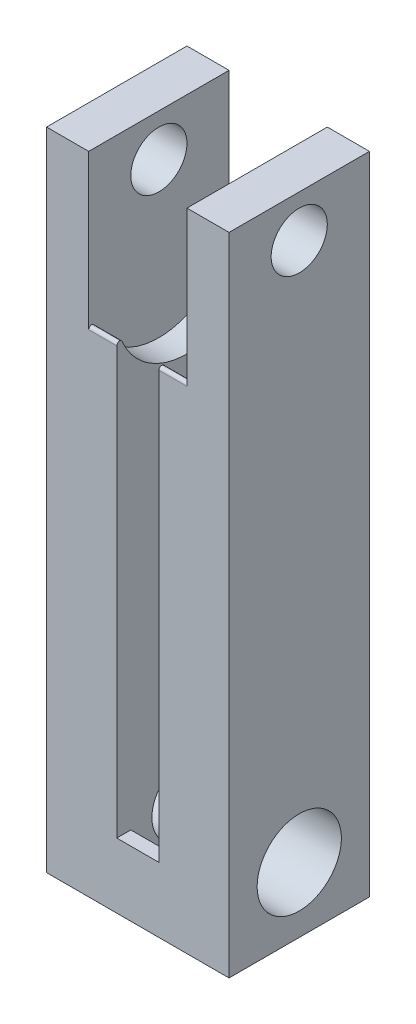
ISO-10303-21;
HEADER;
FILE_DESCRIPTION(('STEP AP214'),'2;1');
FILE_NAME('part.step','',(''),(''),'','','');
FILE_SCHEMA(('AUTOMOTIVE_DESIGN { 1 0 10303 214 1 1 1 1 }'));
ENDSEC;
DATA;
#1=APPLICATION_CONTEXT('core data for automotive mechanical design processes');
#2=APPLICATION_PROTOCOL_DEFINITION('international standard','automotive_design',2000,#1);
#3=PRODUCT_CONTEXT('',#1,'mechanical');
#4=PRODUCT('Part','Part','',(#3));
#5=PRODUCT_RELATED_PRODUCT_CATEGORY('part','',(#4));
#6=PRODUCT_DEFINITION_FORMATION('','',#4);
#7=PRODUCT_DEFINITION_CONTEXT('part definition',#1,'design');
#8=PRODUCT_DEFINITION('design','',#6,#7);
#9=PRODUCT_DEFINITION_SHAPE('','',#8);
#10=(LENGTH_UNIT() NAMED_UNIT(*) SI_UNIT(.MILLI.,.METRE.));
#11=(NAMED_UNIT(*) PLANE_ANGLE_UNIT() SI_UNIT($,.RADIAN.));
#12=(NAMED_UNIT(*) SI_UNIT($,.STERADIAN.) SOLID_ANGLE_UNIT());
#13=UNCERTAINTY_MEASURE_WITH_UNIT(LENGTH_MEASURE(1.E-05),#10,'distance_accuracy_value','');
#14=(GEOMETRIC_REPRESENTATION_CONTEXT(3) GLOBAL_UNCERTAINTY_ASSIGNED_CONTEXT((#13)) GLOBAL_UNIT_ASSIGNED_CONTEXT((#10,
#11,#12)) REPRESENTATION_CONTEXT('',''));
#15=CARTESIAN_POINT('',(0.,0.,0.));
#16=DIRECTION('',(0.,0.,1.));
#17=DIRECTION('',(1.,0.,0.));
#18=AXIS2_PLACEMENT_3D('',#15,#16,#17);
#19=CARTESIAN_POINT('',(-65.,65.,-25.));
#20=DIRECTION('',(1.,0.,0.));
#21=DIRECTION('',(0.,0.,-1.));
#22=AXIS2_PLACEMENT_3D('',#19,#20,#21);
#23=CYLINDRICAL_SURFACE('',#22,10.);
#24=CARTESIAN_POINT('',(-65.,65.,-25.));
#25=DIRECTION('',(1.,0.,0.));
#26=DIRECTION('',(0.,0.,-1.));
#27=AXIS2_PLACEMENT_3D('',#24,#25,#26);
#28=CIRCLE('',#27,10.);
#29=CARTESIAN_POINT('',(-65.,65.,-35.));
#30=VERTEX_POINT('',#29);
#31=EDGE_CURVE('E309',#30,#30,#28,.T.);
#32=ORIENTED_EDGE('',*,*,#31,.F.);
#33=EDGE_LOOP('',(#32));
#34=FACE_BOUND('',#33,.T.);
#35=CARTESIAN_POINT('',(-50.,65.,-25.));
#36=DIRECTION('',(-1.,0.,0.));
#37=DIRECTION('',(0.,0.,1.));
#38=AXIS2_PLACEMENT_3D('',#35,#36,#37);
#39=CIRCLE('',#38,10.);
#40=CARTESIAN_POINT('',(-50.,65.,-15.));
#41=VERTEX_POINT('',#40);
#42=EDGE_CURVE('E312',#41,#41,#39,.T.);
#43=ORIENTED_EDGE('',*,*,#42,.F.);
#44=EDGE_LOOP('',(#43));
#45=FACE_BOUND('',#44,.T.);
#46=ADVANCED_FACE('F53',(#34,#45),#23,.F.);
#47=CARTESIAN_POINT('',(-65.,10.,0.));
#48=DIRECTION('',(1.,0.,0.));
#49=DIRECTION('',(0.,0.,-1.));
#50=AXIS2_PLACEMENT_3D('',#47,#48,#49);
#51=PLANE('',#50);
#52=CARTESIAN_POINT('',(-65.,-126.82547914244,-25.));
#53=DIRECTION('',(1.,0.,0.));
#54=DIRECTION('',(0.,0.,-1.));
#55=AXIS2_PLACEMENT_3D('',#52,#53,#54);
#56=CIRCLE('',#55,12.5);
#57=CARTESIAN_POINT('',(-65.,-126.82547914244,-37.5));
#58=VERTEX_POINT('',#57);
#59=EDGE_CURVE('E297',#58,#58,#56,.T.);
#60=ORIENTED_EDGE('',*,*,#59,.T.);
#61=EDGE_LOOP('',(#60));
#62=FACE_BOUND('',#61,.T.);
#63=ORIENTED_EDGE('',*,*,#31,.T.);
#64=EDGE_LOOP('',(#63));
#65=FACE_BOUND('',#64,.T.);
#66=DIRECTION('',(0.,-1.,0.));
#67=VECTOR('',#66,1.);
#68=CARTESIAN_POINT('',(-65.,10.,-50.));
#69=LINE('',#68,#67);
#70=CARTESIAN_POINT('',(-65.,80.,-50.));
#71=VERTEX_POINT('',#70);
#72=CARTESIAN_POINT('',(-65.,-150.,-50.));
#73=VERTEX_POINT('',#72);
#74=EDGE_CURVE('E330',#71,#73,#69,.T.);
#75=ORIENTED_EDGE('',*,*,#74,.T.);
#76=DIRECTION('',(0.,0.,-1.));
#77=VECTOR('',#76,1.);
#78=CARTESIAN_POINT('',(-65.,-150.,0.));
#79=LINE('',#78,#77);
#80=CARTESIAN_POINT('',(-65.,-150.,0.));
#81=VERTEX_POINT('',#80);
#82=EDGE_CURVE('E300',#81,#73,#79,.T.);
#83=ORIENTED_EDGE('',*,*,#82,.F.);
#84=DIRECTION('',(0.,-1.,0.));
#85=VECTOR('',#84,1.);
#86=CARTESIAN_POINT('',(-65.,10.,0.));
#87=LINE('',#86,#85);
#88=CARTESIAN_POINT('',(-65.,80.,0.));
#89=VERTEX_POINT('',#88);
#90=EDGE_CURVE('E186',#89,#81,#87,.T.);
#91=ORIENTED_EDGE('',*,*,#90,.F.);
#92=DIRECTION('',(0.,0.,1.));
#93=VECTOR('',#92,1.);
#94=CARTESIAN_POINT('',(-65.,80.,-50.));
#95=LINE('',#94,#93);
#96=EDGE_CURVE('E315',#71,#89,#95,.T.);
#97=ORIENTED_EDGE('',*,*,#96,.F.);
#98=EDGE_LOOP('',(#75,#83,#91,#97));
#99=FACE_BOUND('',#98,.T.);
#100=ADVANCED_FACE('F389',(#62,#65,#99),#51,.F.);
#101=CARTESIAN_POINT('',(0.,80.,0.));
#102=DIRECTION('',(0.,1.,0.));
#103=DIRECTION('',(0.,0.,1.));
#104=AXIS2_PLACEMENT_3D('',#101,#102,#103);
#105=PLANE('',#104);
#106=ORIENTED_EDGE('',*,*,#96,.T.);
#107=DIRECTION('',(1.,0.,0.));
#108=VECTOR('',#107,1.);
#109=CARTESIAN_POINT('',(-65.,80.,0.));
#110=LINE('',#109,#108);
#111=CARTESIAN_POINT('',(-50.,80.,0.));
#112=VERTEX_POINT('',#111);
#113=EDGE_CURVE('E318',#89,#112,#110,.T.);
#114=ORIENTED_EDGE('',*,*,#113,.T.);
#115=DIRECTION('',(0.,0.,-1.));
#116=VECTOR('',#115,1.);
#117=CARTESIAN_POINT('',(-50.,80.,-50.));
#118=LINE('',#117,#116);
#119=CARTESIAN_POINT('',(-50.,80.,-50.));
#120=VERTEX_POINT('',#119);
#121=EDGE_CURVE('E320',#112,#120,#118,.T.);
#122=ORIENTED_EDGE('',*,*,#121,.T.);
#123=DIRECTION('',(-1.,0.,0.));
#124=VECTOR('',#123,1.);
#125=CARTESIAN_POINT('',(-65.,80.,-50.));
#126=LINE('',#125,#124);
#127=EDGE_CURVE('E322',#120,#71,#126,.T.);
#128=ORIENTED_EDGE('',*,*,#127,.T.);
#129=EDGE_LOOP('',(#106,#114,#122,#128));
#130=FACE_BOUND('',#129,.T.);
#131=ADVANCED_FACE('F392',(#130),#105,.T.);
#132=CARTESIAN_POINT('',(-50.,80.,-50.));
#133=DIRECTION('',(-1.,0.,0.));
#134=DIRECTION('',(0.,0.,1.));
#135=AXIS2_PLACEMENT_3D('',#132,#133,#134);
#136=PLANE('',#135);
#137=ORIENTED_EDGE('',*,*,#42,.T.);
#138=EDGE_LOOP('',(#137));
#139=FACE_BOUND('',#138,.T.);
#140=DIRECTION('',(0.,-1.,0.));
#141=VECTOR('',#140,1.);
#142=CARTESIAN_POINT('',(-50.,80.,0.));
#143=LINE('',#142,#141);
#144=CARTESIAN_POINT('',(-50.,25.,0.));
#145=VERTEX_POINT('',#144);
#146=EDGE_CURVE('E326',#112,#145,#143,.T.);
#147=ORIENTED_EDGE('',*,*,#146,.T.);
#148=CARTESIAN_POINT('',(-50.,25.,-0.999999999999994));
#149=DIRECTION('',(-1.,0.,0.));
#150=DIRECTION('',(0.,0.,1.));
#151=AXIS2_PLACEMENT_3D('',#148,#149,#150);
#152=CIRCLE('',#151,1.);
#153=CARTESIAN_POINT('',(-50.,25.3846153846154,-1.92307692307692));
#154=VERTEX_POINT('',#153);
#155=EDGE_CURVE('E341',#145,#154,#152,.T.);
#156=ORIENTED_EDGE('',*,*,#155,.T.);
#157=CARTESIAN_POINT('',(-50.,35.,-25.));
#158=DIRECTION('',(1.,0.,0.));
#159=DIRECTION('',(0.,0.,-1.));
#160=AXIS2_PLACEMENT_3D('',#157,#158,#159);
#161=CIRCLE('',#160,25.);
#162=CARTESIAN_POINT('',(-50.,25.3846153846154,-48.0769230769231));
#163=VERTEX_POINT('',#162);
#164=EDGE_CURVE('E306',#163,#154,#161,.F.);
#165=ORIENTED_EDGE('',*,*,#164,.F.);
#166=CARTESIAN_POINT('',(-50.,25.,-49.));
#167=DIRECTION('',(-1.,0.,0.));
#168=DIRECTION('',(0.,0.,1.));
#169=AXIS2_PLACEMENT_3D('',#166,#167,#168);
#170=CIRCLE('',#169,1.);
#171=CARTESIAN_POINT('',(-50.,25.,-50.));
#172=VERTEX_POINT('',#171);
#173=EDGE_CURVE('E61',#163,#172,#170,.T.);
#174=ORIENTED_EDGE('',*,*,#173,.T.);
#175=DIRECTION('',(0.,-1.,0.));
#176=VECTOR('',#175,1.);
#177=CARTESIAN_POINT('',(-50.,80.,-50.));
#178=LINE('',#177,#176);
#179=EDGE_CURVE('E76',#120,#172,#178,.T.);
#180=ORIENTED_EDGE('',*,*,#179,.F.);
#181=ORIENTED_EDGE('',*,*,#121,.F.);
#182=EDGE_LOOP('',(#147,#156,#165,#174,#180,#181));
#183=FACE_BOUND('',#182,.T.);
#184=ADVANCED_FACE('F346',(#139,#183),#136,.F.);
#185=CARTESIAN_POINT('',(0.,-150.,0.));
#186=DIRECTION('',(0.,-1.,0.));
#187=DIRECTION('',(0.,0.,-1.));
#188=AXIS2_PLACEMENT_3D('',#185,#186,#187);
#189=PLANE('',#188);
#190=ORIENTED_EDGE('',*,*,#82,.T.);
#191=DIRECTION('',(1.,0.,0.));
#192=VECTOR('',#191,1.);
#193=CARTESIAN_POINT('',(-65.,-150.,-50.));
#194=LINE('',#193,#192);
#195=CARTESIAN_POINT('',(0.,-150.,-50.));
#196=VERTEX_POINT('',#195);
#197=EDGE_CURVE('E192',#73,#196,#194,.T.);
#198=ORIENTED_EDGE('',*,*,#197,.T.);
#199=DIRECTION('',(0.,0.,1.));
#200=VECTOR('',#199,1.);
#201=CARTESIAN_POINT('',(0.,-150.,-50.));
#202=LINE('',#201,#200);
#203=CARTESIAN_POINT('',(0.,-150.,0.));
#204=VERTEX_POINT('',#203);
#205=EDGE_CURVE('E198',#196,#204,#202,.T.);
#206=ORIENTED_EDGE('',*,*,#205,.T.);
#207=DIRECTION('',(-1.,0.,0.));
#208=VECTOR('',#207,1.);
#209=CARTESIAN_POINT('',(-65.,-150.,0.));
#210=LINE('',#209,#208);
#211=EDGE_CURVE('E179',#204,#81,#210,.T.);
#212=ORIENTED_EDGE('',*,*,#211,.T.);
#213=EDGE_LOOP('',(#190,#198,#206,#212));
#214=FACE_BOUND('',#213,.T.);
#215=ADVANCED_FACE('F203',(#214),#189,.T.);
#216=CARTESIAN_POINT('',(-190.,-126.82547914244,-25.));
#217=DIRECTION('',(1.,0.,0.));
#218=DIRECTION('',(0.,0.,-1.));
#219=AXIS2_PLACEMENT_3D('',#216,#217,#218);
#220=CYLINDRICAL_SURFACE('',#219,12.5);
#221=CARTESIAN_POINT('',(-40.,-126.82547914244,-25.));
#222=DIRECTION('',(1.,0.,0.));
#223=DIRECTION('',(0.,0.,-1.));
#224=AXIS2_PLACEMENT_3D('',#221,#222,#223);
#225=CIRCLE('',#224,12.5);
#226=CARTESIAN_POINT('',(-40.,-126.82547914244,-37.5));
#227=VERTEX_POINT('',#226);
#228=EDGE_CURVE('E294',#227,#227,#225,.T.);
#229=ORIENTED_EDGE('',*,*,#228,.T.);
#230=EDGE_LOOP('',(#229));
#231=FACE_BOUND('',#230,.T.);
#232=ORIENTED_EDGE('',*,*,#59,.F.);
#233=EDGE_LOOP('',(#232));
#234=FACE_BOUND('',#233,.T.);
#235=ADVANCED_FACE('F441',(#231,#234),#220,.F.);
#236=CARTESIAN_POINT('',(0.00200000000000638,25.,-49.));
#237=DIRECTION('',(-1.,0.,0.));
#238=DIRECTION('',(0.,0.,1.));
#239=AXIS2_PLACEMENT_3D('',#236,#237,#238);
#240=CYLINDRICAL_SURFACE('',#239,1.);
#241=CARTESIAN_POINT('',(-40.,25.,-49.));
#242=DIRECTION('',(-1.,0.,0.));
#243=DIRECTION('',(0.,0.,1.));
#244=AXIS2_PLACEMENT_3D('',#241,#242,#243);
#245=CIRCLE('',#244,1.);
#246=CARTESIAN_POINT('',(-40.,25.,-50.));
#247=VERTEX_POINT('',#246);
#248=CARTESIAN_POINT('',(-40.,25.3846153846154,-48.0769230769231));
#249=VERTEX_POINT('',#248);
#250=EDGE_CURVE('E12',#247,#249,#245,.F.);
#251=ORIENTED_EDGE('',*,*,#250,.F.);
#252=DIRECTION('',(-1.,0.,0.));
#253=VECTOR('',#252,1.);
#254=CARTESIAN_POINT('',(0.,25.,-50.));
#255=LINE('',#254,#253);
#256=EDGE_CURVE('E339',#172,#247,#255,.F.);
#257=ORIENTED_EDGE('',*,*,#256,.F.);
#258=ORIENTED_EDGE('',*,*,#173,.F.);
#259=DIRECTION('',(-1.,0.,0.));
#260=VECTOR('',#259,1.);
#261=CARTESIAN_POINT('',(0.00200000000000574,25.3846153846154,-48.0769230769231));
#262=LINE('',#261,#260);
#263=EDGE_CURVE('E334',#249,#163,#262,.T.);
#264=ORIENTED_EDGE('',*,*,#263,.F.);
#265=EDGE_LOOP('',(#251,#257,#258,#264));
#266=FACE_BOUND('',#265,.T.);
#267=ADVANCED_FACE('F55',(#266),#240,.T.);
#268=CARTESIAN_POINT('',(0.00200000000001188,25.,-1.));
#269=DIRECTION('',(-1.,0.,0.));
#270=DIRECTION('',(0.,0.,1.));
#271=AXIS2_PLACEMENT_3D('',#268,#269,#270);
#272=CYLINDRICAL_SURFACE('',#271,1.);
#273=CARTESIAN_POINT('',(-40.,25.,-0.999999999999995));
#274=DIRECTION('',(-1.,0.,0.));
#275=DIRECTION('',(0.,0.,1.));
#276=AXIS2_PLACEMENT_3D('',#273,#274,#275);
#277=CIRCLE('',#276,1.);
#278=CARTESIAN_POINT('',(-40.,25.3846153846154,-1.92307692307692));
#279=VERTEX_POINT('',#278);
#280=CARTESIAN_POINT('',(-40.,25.,0.));
#281=VERTEX_POINT('',#280);
#282=EDGE_CURVE('E291',#279,#281,#277,.F.);
#283=ORIENTED_EDGE('',*,*,#282,.F.);
#284=DIRECTION('',(-1.,0.,0.));
#285=VECTOR('',#284,1.);
#286=CARTESIAN_POINT('',(0.00200000000001214,25.3846153846154,-1.92307692307692));
#287=LINE('',#286,#285);
#288=EDGE_CURVE('E336',#154,#279,#287,.F.);
#289=ORIENTED_EDGE('',*,*,#288,.F.);
#290=ORIENTED_EDGE('',*,*,#155,.F.);
#291=DIRECTION('',(-1.,0.,0.));
#292=VECTOR('',#291,1.);
#293=CARTESIAN_POINT('',(0.,25.,0.));
#294=LINE('',#293,#292);
#295=EDGE_CURVE('E332',#281,#145,#294,.T.);
#296=ORIENTED_EDGE('',*,*,#295,.F.);
#297=EDGE_LOOP('',(#283,#289,#290,#296));
#298=FACE_BOUND('',#297,.T.);
#299=ADVANCED_FACE('F399',(#298),#272,.T.);
#300=CARTESIAN_POINT('',(0.00200000000000894,35.,-25.));
#301=DIRECTION('',(-1.,0.,0.));
#302=DIRECTION('',(0.,0.,1.));
#303=AXIS2_PLACEMENT_3D('',#300,#301,#302);
#304=CYLINDRICAL_SURFACE('',#303,25.);
#305=ORIENTED_EDGE('',*,*,#288,.T.);
#306=CARTESIAN_POINT('',(-40.,35.,-25.));
#307=DIRECTION('',(-1.,0.,0.));
#308=DIRECTION('',(0.,0.,1.));
#309=AXIS2_PLACEMENT_3D('',#306,#307,#308);
#310=CIRCLE('',#309,25.);
#311=EDGE_CURVE('E276',#279,#249,#310,.F.);
#312=ORIENTED_EDGE('',*,*,#311,.T.);
#313=ORIENTED_EDGE('',*,*,#263,.T.);
#314=ORIENTED_EDGE('',*,*,#164,.T.);
#315=EDGE_LOOP('',(#305,#312,#313,#314));
#316=FACE_BOUND('',#315,.T.);
#317=ADVANCED_FACE('F401',(#316),#304,.F.);
#318=CARTESIAN_POINT('',(-40.,-150.,0.));
#319=DIRECTION('',(-1.,0.,0.));
#320=DIRECTION('',(0.,0.,1.));
#321=AXIS2_PLACEMENT_3D('',#318,#319,#320);
#322=PLANE('',#321);
#323=ORIENTED_EDGE('',*,*,#228,.F.);
#324=EDGE_LOOP('',(#323));
#325=FACE_BOUND('',#324,.T.);
#326=DIRECTION('',(0.,1.,0.));
#327=VECTOR('',#326,1.);
#328=CARTESIAN_POINT('',(-40.,-150.,0.));
#329=LINE('',#328,#327);
#330=CARTESIAN_POINT('',(-40.,-126.82547914244,0.));
#331=VERTEX_POINT('',#330);
#332=EDGE_CURVE('E191',#331,#281,#329,.T.);
#333=ORIENTED_EDGE('',*,*,#332,.F.);
#334=DIRECTION('',(0.,0.,-1.));
#335=VECTOR('',#334,1.);
#336=CARTESIAN_POINT('',(-40.,-126.82547914244,-4.99999999999999));
#337=LINE('',#336,#335);
#338=CARTESIAN_POINT('',(-40.,-126.82547914244,-5.));
#339=VERTEX_POINT('',#338);
#340=EDGE_CURVE('E266',#331,#339,#337,.T.);
#341=ORIENTED_EDGE('',*,*,#340,.T.);
#342=CARTESIAN_POINT('',(-40.,-126.82547914244,-25.));
#343=DIRECTION('',(-1.,0.,0.));
#344=DIRECTION('',(0.,0.,1.));
#345=AXIS2_PLACEMENT_3D('',#342,#343,#344);
#346=CIRCLE('',#345,20.);
#347=CARTESIAN_POINT('',(-40.,-126.82547914244,-45.));
#348=VERTEX_POINT('',#347);
#349=EDGE_CURVE('E277',#339,#348,#346,.F.);
#350=ORIENTED_EDGE('',*,*,#349,.T.);
#351=DIRECTION('',(0.,0.,-1.));
#352=VECTOR('',#351,1.);
#353=CARTESIAN_POINT('',(-40.,-126.82547914244,-45.));
#354=LINE('',#353,#352);
#355=CARTESIAN_POINT('',(-40.,-126.82547914244,-50.));
#356=VERTEX_POINT('',#355);
#357=EDGE_CURVE('E274',#348,#356,#354,.T.);
#358=ORIENTED_EDGE('',*,*,#357,.T.);
#359=DIRECTION('',(0.,1.,0.));
#360=VECTOR('',#359,1.);
#361=CARTESIAN_POINT('',(-40.,-150.,-50.));
#362=LINE('',#361,#360);
#363=EDGE_CURVE('E304',#356,#247,#362,.T.);
#364=ORIENTED_EDGE('',*,*,#363,.T.);
#365=ORIENTED_EDGE('',*,*,#250,.T.);
#366=ORIENTED_EDGE('',*,*,#311,.F.);
#367=ORIENTED_EDGE('',*,*,#282,.T.);
#368=EDGE_LOOP('',(#333,#341,#350,#358,#364,#365,#366,#367));
#369=FACE_BOUND('',#368,.T.);
#370=ADVANCED_FACE('F356',(#325,#369),#322,.F.);
#371=CARTESIAN_POINT('',(0.,10.,0.));
#372=DIRECTION('',(0.,0.,-1.));
#373=DIRECTION('',(-1.,0.,0.));
#374=AXIS2_PLACEMENT_3D('',#371,#372,#373);
#375=PLANE('',#374);
#376=ORIENTED_EDGE('',*,*,#211,.F.);
#377=DIRECTION('',(0.,-1.,0.));
#378=VECTOR('',#377,1.);
#379=CARTESIAN_POINT('',(0.,10.,0.));
#380=LINE('',#379,#378);
#381=CARTESIAN_POINT('',(0.,80.,0.));
#382=VERTEX_POINT('',#381);
#383=EDGE_CURVE('E183',#382,#204,#380,.T.);
#384=ORIENTED_EDGE('',*,*,#383,.F.);
#385=DIRECTION('',(1.,0.,0.));
#386=VECTOR('',#385,1.);
#387=CARTESIAN_POINT('',(0.,80.,0.));
#388=LINE('',#387,#386);
#389=CARTESIAN_POINT('',(-15.,80.,0.));
#390=VERTEX_POINT('',#389);
#391=EDGE_CURVE('E238',#390,#382,#388,.T.);
#392=ORIENTED_EDGE('',*,*,#391,.F.);
#393=DIRECTION('',(0.,-1.,0.));
#394=VECTOR('',#393,1.);
#395=CARTESIAN_POINT('',(-15.,80.,0.));
#396=LINE('',#395,#394);
#397=CARTESIAN_POINT('',(-15.,25.,0.));
#398=VERTEX_POINT('',#397);
#399=EDGE_CURVE('E234',#390,#398,#396,.T.);
#400=ORIENTED_EDGE('',*,*,#399,.T.);
#401=DIRECTION('',(-1.,0.,0.));
#402=VECTOR('',#401,1.);
#403=CARTESIAN_POINT('',(0.,25.,0.));
#404=LINE('',#403,#402);
#405=CARTESIAN_POINT('',(-25.,25.,0.));
#406=VERTEX_POINT('',#405);
#407=EDGE_CURVE('E230',#398,#406,#404,.T.);
#408=ORIENTED_EDGE('',*,*,#407,.T.);
#409=DIRECTION('',(0.,-1.,0.));
#410=VECTOR('',#409,1.);
#411=CARTESIAN_POINT('',(-25.,150.,0.));
#412=LINE('',#411,#410);
#413=CARTESIAN_POINT('',(-25.,-126.82547914244,0.));
#414=VERTEX_POINT('',#413);
#415=EDGE_CURVE('E237',#406,#414,#412,.T.);
#416=ORIENTED_EDGE('',*,*,#415,.T.);
#417=DIRECTION('',(1.,0.,0.));
#418=VECTOR('',#417,1.);
#419=CARTESIAN_POINT('',(-95.1095129444772,-126.82547914244,0.));
#420=LINE('',#419,#418);
#421=EDGE_CURVE('E267',#331,#414,#420,.T.);
#422=ORIENTED_EDGE('',*,*,#421,.F.);
#423=ORIENTED_EDGE('',*,*,#332,.T.);
#424=ORIENTED_EDGE('',*,*,#295,.T.);
#425=ORIENTED_EDGE('',*,*,#146,.F.);
#426=ORIENTED_EDGE('',*,*,#113,.F.);
#427=ORIENTED_EDGE('',*,*,#90,.T.);
#428=EDGE_LOOP('',(#376,#384,#392,#400,#408,#416,#422,#423,#424,#425,#426,#427));
#429=FACE_BOUND('',#428,.T.);
#430=ADVANCED_FACE('F181',(#429),#375,.F.);
#431=CARTESIAN_POINT('',(0.,10.,-50.));
#432=DIRECTION('',(0.,0.,1.));
#433=DIRECTION('',(1.,0.,0.));
#434=AXIS2_PLACEMENT_3D('',#431,#432,#433);
#435=PLANE('',#434);
#436=ORIENTED_EDGE('',*,*,#256,.T.);
#437=ORIENTED_EDGE('',*,*,#363,.F.);
#438=DIRECTION('',(1.,0.,0.));
#439=VECTOR('',#438,1.);
#440=CARTESIAN_POINT('',(-95.1095129444772,-126.82547914244,-50.));
#441=LINE('',#440,#439);
#442=CARTESIAN_POINT('',(-25.,-126.82547914244,-50.));
#443=VERTEX_POINT('',#442);
#444=EDGE_CURVE('E68',#356,#443,#441,.T.);
#445=ORIENTED_EDGE('',*,*,#444,.T.);
#446=DIRECTION('',(0.,-1.,0.));
#447=VECTOR('',#446,1.);
#448=CARTESIAN_POINT('',(-25.,150.,-50.));
#449=LINE('',#448,#447);
#450=CARTESIAN_POINT('',(-25.,25.,-50.));
#451=VERTEX_POINT('',#450);
#452=EDGE_CURVE('E218',#451,#443,#449,.T.);
#453=ORIENTED_EDGE('',*,*,#452,.F.);
#454=DIRECTION('',(-1.,0.,0.));
#455=VECTOR('',#454,1.);
#456=CARTESIAN_POINT('',(0.,25.,-50.));
#457=LINE('',#456,#455);
#458=CARTESIAN_POINT('',(-15.,25.,-50.));
#459=VERTEX_POINT('',#458);
#460=EDGE_CURVE('E206',#451,#459,#457,.F.);
#461=ORIENTED_EDGE('',*,*,#460,.T.);
#462=DIRECTION('',(0.,-1.,0.));
#463=VECTOR('',#462,1.);
#464=CARTESIAN_POINT('',(-15.,80.,-50.));
#465=LINE('',#464,#463);
#466=CARTESIAN_POINT('',(-15.,80.,-50.));
#467=VERTEX_POINT('',#466);
#468=EDGE_CURVE('E223',#467,#459,#465,.T.);
#469=ORIENTED_EDGE('',*,*,#468,.F.);
#470=DIRECTION('',(-1.,0.,0.));
#471=VECTOR('',#470,1.);
#472=CARTESIAN_POINT('',(0.,80.,-50.));
#473=LINE('',#472,#471);
#474=CARTESIAN_POINT('',(0.,80.,-50.));
#475=VERTEX_POINT('',#474);
#476=EDGE_CURVE('E243',#475,#467,#473,.T.);
#477=ORIENTED_EDGE('',*,*,#476,.F.);
#478=DIRECTION('',(0.,-1.,0.));
#479=VECTOR('',#478,1.);
#480=CARTESIAN_POINT('',(0.,10.,-50.));
#481=LINE('',#480,#479);
#482=EDGE_CURVE('E209',#475,#196,#481,.T.);
#483=ORIENTED_EDGE('',*,*,#482,.T.);
#484=ORIENTED_EDGE('',*,*,#197,.F.);
#485=ORIENTED_EDGE('',*,*,#74,.F.);
#486=ORIENTED_EDGE('',*,*,#127,.F.);
#487=ORIENTED_EDGE('',*,*,#179,.T.);
#488=EDGE_LOOP('',(#436,#437,#445,#453,#461,#469,#477,#483,#484,#485,#486,#487));
#489=FACE_BOUND('',#488,.T.);
#490=ADVANCED_FACE('F352',(#489),#435,.F.);
#491=CARTESIAN_POINT('',(-95.1095129444772,-126.82547914244,-25.));
#492=DIRECTION('',(1.,0.,0.));
#493=DIRECTION('',(0.,0.,-1.));
#494=AXIS2_PLACEMENT_3D('',#491,#492,#493);
#495=CYLINDRICAL_SURFACE('',#494,20.);
#496=ORIENTED_EDGE('',*,*,#349,.F.);
#497=DIRECTION('',(1.,0.,0.));
#498=VECTOR('',#497,1.);
#499=CARTESIAN_POINT('',(-95.1095129444772,-126.82547914244,-5.));
#500=LINE('',#499,#498);
#501=CARTESIAN_POINT('',(-25.,-126.82547914244,-5.));
#502=VERTEX_POINT('',#501);
#503=EDGE_CURVE('E256',#339,#502,#500,.T.);
#504=ORIENTED_EDGE('',*,*,#503,.T.);
#505=CARTESIAN_POINT('',(-25.,-126.82547914244,-25.));
#506=DIRECTION('',(1.,0.,0.));
#507=DIRECTION('',(0.,0.,1.));
#508=AXIS2_PLACEMENT_3D('',#505,#506,#507);
#509=CIRCLE('',#508,20.);
#510=CARTESIAN_POINT('',(-25.,-126.82547914244,-45.));
#511=VERTEX_POINT('',#510);
#512=EDGE_CURVE('E271',#502,#511,#509,.T.);
#513=ORIENTED_EDGE('',*,*,#512,.T.);
#514=DIRECTION('',(1.,0.,0.));
#515=VECTOR('',#514,1.);
#516=CARTESIAN_POINT('',(-95.1095129444772,-126.82547914244,-45.));
#517=LINE('',#516,#515);
#518=EDGE_CURVE('E270',#348,#511,#517,.T.);
#519=ORIENTED_EDGE('',*,*,#518,.F.);
#520=EDGE_LOOP('',(#496,#504,#513,#519));
#521=FACE_BOUND('',#520,.T.);
#522=ADVANCED_FACE('F361',(#521),#495,.F.);
#523=CARTESIAN_POINT('',(-95.1095129444772,-126.82547914244,-45.));
#524=DIRECTION('',(0.,-1.,0.));
#525=DIRECTION('',(0.,0.,-1.));
#526=AXIS2_PLACEMENT_3D('',#523,#524,#525);
#527=PLANE('',#526);
#528=ORIENTED_EDGE('',*,*,#357,.F.);
#529=ORIENTED_EDGE('',*,*,#518,.T.);
#530=DIRECTION('',(0.,0.,-1.));
#531=VECTOR('',#530,1.);
#532=CARTESIAN_POINT('',(-25.,-126.82547914244,-45.));
#533=LINE('',#532,#531);
#534=EDGE_CURVE('E268',#511,#443,#533,.T.);
#535=ORIENTED_EDGE('',*,*,#534,.T.);
#536=ORIENTED_EDGE('',*,*,#444,.F.);
#537=EDGE_LOOP('',(#528,#529,#535,#536));
#538=FACE_BOUND('',#537,.T.);
#539=ADVANCED_FACE('F359',(#538),#527,.F.);
#540=CARTESIAN_POINT('',(-95.1095129444772,-126.82547914244,-5.));
#541=DIRECTION('',(0.,-1.,0.));
#542=DIRECTION('',(0.,0.,-1.));
#543=AXIS2_PLACEMENT_3D('',#540,#541,#542);
#544=PLANE('',#543);
#545=ORIENTED_EDGE('',*,*,#340,.F.);
#546=ORIENTED_EDGE('',*,*,#421,.T.);
#547=DIRECTION('',(0.,0.,-1.));
#548=VECTOR('',#547,1.);
#549=CARTESIAN_POINT('',(-25.,-126.82547914244,-5.));
#550=LINE('',#549,#548);
#551=EDGE_CURVE('E263',#414,#502,#550,.T.);
#552=ORIENTED_EDGE('',*,*,#551,.T.);
#553=ORIENTED_EDGE('',*,*,#503,.F.);
#554=EDGE_LOOP('',(#545,#546,#552,#553));
#555=FACE_BOUND('',#554,.T.);
#556=ADVANCED_FACE('F404',(#555),#544,.F.);
#557=CARTESIAN_POINT('',(0.00200000000000894,35.,-25.));
#558=DIRECTION('',(-1.,0.,0.));
#559=DIRECTION('',(0.,0.,1.));
#560=AXIS2_PLACEMENT_3D('',#557,#558,#559);
#561=CYLINDRICAL_SURFACE('',#560,25.);
#562=DIRECTION('',(-1.,0.,0.));
#563=VECTOR('',#562,1.);
#564=CARTESIAN_POINT('',(0.00200000000000574,25.3846153846154,-48.0769230769231));
#565=LINE('',#564,#563);
#566=CARTESIAN_POINT('',(-15.,25.3846153846154,-48.0769230769231));
#567=VERTEX_POINT('',#566);
#568=CARTESIAN_POINT('',(-25.,25.3846153846154,-48.0769230769231));
#569=VERTEX_POINT('',#568);
#570=EDGE_CURVE('E236',#567,#569,#565,.T.);
#571=ORIENTED_EDGE('',*,*,#570,.T.);
#572=CARTESIAN_POINT('',(-25.,35.,-25.));
#573=DIRECTION('',(1.,0.,0.));
#574=DIRECTION('',(0.,0.,-1.));
#575=AXIS2_PLACEMENT_3D('',#572,#573,#574);
#576=CIRCLE('',#575,25.);
#577=CARTESIAN_POINT('',(-25.,25.3846153846154,-1.92307692307692));
#578=VERTEX_POINT('',#577);
#579=EDGE_CURVE('E251',#569,#578,#576,.F.);
#580=ORIENTED_EDGE('',*,*,#579,.T.);
#581=DIRECTION('',(-1.,0.,0.));
#582=VECTOR('',#581,1.);
#583=CARTESIAN_POINT('',(0.00200000000001214,25.3846153846154,-1.92307692307692));
#584=LINE('',#583,#582);
#585=CARTESIAN_POINT('',(-15.,25.3846153846154,-1.92307692307692));
#586=VERTEX_POINT('',#585);
#587=EDGE_CURVE('E229',#578,#586,#584,.F.);
#588=ORIENTED_EDGE('',*,*,#587,.T.);
#589=CARTESIAN_POINT('',(-15.,35.,-25.));
#590=DIRECTION('',(1.,0.,0.));
#591=DIRECTION('',(0.,0.,-1.));
#592=AXIS2_PLACEMENT_3D('',#589,#590,#591);
#593=CIRCLE('',#592,25.);
#594=EDGE_CURVE('E222',#567,#586,#593,.F.);
#595=ORIENTED_EDGE('',*,*,#594,.F.);
#596=EDGE_LOOP('',(#571,#580,#588,#595));
#597=FACE_BOUND('',#596,.T.);
#598=ADVANCED_FACE('F378',(#597),#561,.F.);
#599=CARTESIAN_POINT('',(0.00200000000001188,25.,-1.));
#600=DIRECTION('',(-1.,0.,0.));
#601=DIRECTION('',(0.,0.,1.));
#602=AXIS2_PLACEMENT_3D('',#599,#600,#601);
#603=CYLINDRICAL_SURFACE('',#602,1.);
#604=CARTESIAN_POINT('',(-25.,25.,-0.999999999999997));
#605=DIRECTION('',(1.,0.,0.));
#606=DIRECTION('',(0.,0.,-1.));
#607=AXIS2_PLACEMENT_3D('',#604,#605,#606);
#608=CIRCLE('',#607,1.);
#609=EDGE_CURVE('E219',#406,#578,#608,.F.);
#610=ORIENTED_EDGE('',*,*,#609,.F.);
#611=ORIENTED_EDGE('',*,*,#407,.F.);
#612=CARTESIAN_POINT('',(-15.,25.,-0.999999999999999));
#613=DIRECTION('',(1.,0.,0.));
#614=DIRECTION('',(0.,0.,-1.));
#615=AXIS2_PLACEMENT_3D('',#612,#613,#614);
#616=CIRCLE('',#615,1.);
#617=EDGE_CURVE('E201',#586,#398,#616,.T.);
#618=ORIENTED_EDGE('',*,*,#617,.F.);
#619=ORIENTED_EDGE('',*,*,#587,.F.);
#620=EDGE_LOOP('',(#610,#611,#618,#619));
#621=FACE_BOUND('',#620,.T.);
#622=ADVANCED_FACE('F382',(#621),#603,.T.);
#623=CARTESIAN_POINT('',(0.00200000000000638,25.,-49.));
#624=DIRECTION('',(-1.,0.,0.));
#625=DIRECTION('',(0.,0.,1.));
#626=AXIS2_PLACEMENT_3D('',#623,#624,#625);
#627=CYLINDRICAL_SURFACE('',#626,1.);
#628=CARTESIAN_POINT('',(-25.,25.,-49.));
#629=DIRECTION('',(1.,0.,0.));
#630=DIRECTION('',(0.,0.,-1.));
#631=AXIS2_PLACEMENT_3D('',#628,#629,#630);
#632=CIRCLE('',#631,1.);
#633=EDGE_CURVE('E216',#569,#451,#632,.F.);
#634=ORIENTED_EDGE('',*,*,#633,.F.);
#635=ORIENTED_EDGE('',*,*,#570,.F.);
#636=CARTESIAN_POINT('',(-15.,25.,-49.));
#637=DIRECTION('',(1.,0.,0.));
#638=DIRECTION('',(0.,0.,-1.));
#639=AXIS2_PLACEMENT_3D('',#636,#637,#638);
#640=CIRCLE('',#639,1.);
#641=EDGE_CURVE('E220',#459,#567,#640,.T.);
#642=ORIENTED_EDGE('',*,*,#641,.F.);
#643=ORIENTED_EDGE('',*,*,#460,.F.);
#644=EDGE_LOOP('',(#634,#635,#642,#643));
#645=FACE_BOUND('',#644,.T.);
#646=ADVANCED_FACE('F370',(#645),#627,.T.);
#647=CARTESIAN_POINT('',(-15.,80.,-50.));
#648=DIRECTION('',(1.,0.,0.));
#649=DIRECTION('',(0.,0.,-1.));
#650=AXIS2_PLACEMENT_3D('',#647,#648,#649);
#651=PLANE('',#650);
#652=CARTESIAN_POINT('',(-15.,65.,-25.));
#653=DIRECTION('',(1.,0.,0.));
#654=DIRECTION('',(0.,0.,-1.));
#655=AXIS2_PLACEMENT_3D('',#652,#653,#654);
#656=CIRCLE('',#655,10.);
#657=CARTESIAN_POINT('',(-15.,65.,-35.));
#658=VERTEX_POINT('',#657);
#659=EDGE_CURVE('E226',#658,#658,#656,.T.);
#660=ORIENTED_EDGE('',*,*,#659,.T.);
#661=EDGE_LOOP('',(#660));
#662=FACE_BOUND('',#661,.T.);
#663=ORIENTED_EDGE('',*,*,#468,.T.);
#664=ORIENTED_EDGE('',*,*,#641,.T.);
#665=ORIENTED_EDGE('',*,*,#594,.T.);
#666=ORIENTED_EDGE('',*,*,#617,.T.);
#667=ORIENTED_EDGE('',*,*,#399,.F.);
#668=DIRECTION('',(0.,0.,1.));
#669=VECTOR('',#668,1.);
#670=CARTESIAN_POINT('',(-15.,80.,-50.));
#671=LINE('',#670,#669);
#672=EDGE_CURVE('E241',#467,#390,#671,.T.);
#673=ORIENTED_EDGE('',*,*,#672,.F.);
#674=EDGE_LOOP('',(#663,#664,#665,#666,#667,#673));
#675=FACE_BOUND('',#674,.T.);
#676=ADVANCED_FACE('F374',(#662,#675),#651,.F.);
#677=CARTESIAN_POINT('',(0.,10.,0.));
#678=DIRECTION('',(-1.,0.,0.));
#679=DIRECTION('',(0.,0.,1.));
#680=AXIS2_PLACEMENT_3D('',#677,#678,#679);
#681=PLANE('',#680);
#682=CARTESIAN_POINT('',(0.,-126.82547914244,-25.));
#683=DIRECTION('',(-1.,0.,0.));
#684=DIRECTION('',(0.,0.,1.));
#685=AXIS2_PLACEMENT_3D('',#682,#683,#684);
#686=CIRCLE('',#685,15.);
#687=CARTESIAN_POINT('',(0.,-126.82547914244,-9.99999999999999));
#688=VERTEX_POINT('',#687);
#689=EDGE_CURVE('E207',#688,#688,#686,.T.);
#690=ORIENTED_EDGE('',*,*,#689,.T.);
#691=EDGE_LOOP('',(#690));
#692=FACE_BOUND('',#691,.T.);
#693=CARTESIAN_POINT('',(0.,65.,-25.));
#694=DIRECTION('',(1.,0.,0.));
#695=DIRECTION('',(0.,0.,-1.));
#696=AXIS2_PLACEMENT_3D('',#693,#694,#695);
#697=CIRCLE('',#696,10.);
#698=CARTESIAN_POINT('',(0.,65.,-35.));
#699=VERTEX_POINT('',#698);
#700=EDGE_CURVE('E240',#699,#699,#697,.T.);
#701=ORIENTED_EDGE('',*,*,#700,.F.);
#702=EDGE_LOOP('',(#701));
#703=FACE_BOUND('',#702,.T.);
#704=ORIENTED_EDGE('',*,*,#383,.T.);
#705=ORIENTED_EDGE('',*,*,#205,.F.);
#706=ORIENTED_EDGE('',*,*,#482,.F.);
#707=DIRECTION('',(0.,0.,-1.));
#708=VECTOR('',#707,1.);
#709=CARTESIAN_POINT('',(0.,80.,-50.));
#710=LINE('',#709,#708);
#711=EDGE_CURVE('E200',#382,#475,#710,.T.);
#712=ORIENTED_EDGE('',*,*,#711,.F.);
#713=EDGE_LOOP('',(#704,#705,#706,#712));
#714=FACE_BOUND('',#713,.T.);
#715=ADVANCED_FACE('F197',(#692,#703,#714),#681,.F.);
#716=CARTESIAN_POINT('',(0.,80.,0.));
#717=DIRECTION('',(0.,-1.,0.));
#718=DIRECTION('',(0.,0.,-1.));
#719=AXIS2_PLACEMENT_3D('',#716,#717,#718);
#720=PLANE('',#719);
#721=ORIENTED_EDGE('',*,*,#711,.T.);
#722=ORIENTED_EDGE('',*,*,#476,.T.);
#723=ORIENTED_EDGE('',*,*,#672,.T.);
#724=ORIENTED_EDGE('',*,*,#391,.T.);
#725=EDGE_LOOP('',(#721,#722,#723,#724));
#726=FACE_BOUND('',#725,.T.);
#727=ADVANCED_FACE('F386',(#726),#720,.F.);
#728=CARTESIAN_POINT('',(-65.,65.,-25.));
#729=DIRECTION('',(1.,0.,0.));
#730=DIRECTION('',(0.,0.,-1.));
#731=AXIS2_PLACEMENT_3D('',#728,#729,#730);
#732=CYLINDRICAL_SURFACE('',#731,10.);
#733=ORIENTED_EDGE('',*,*,#700,.T.);
#734=EDGE_LOOP('',(#733));
#735=FACE_BOUND('',#734,.T.);
#736=ORIENTED_EDGE('',*,*,#659,.F.);
#737=EDGE_LOOP('',(#736));
#738=FACE_BOUND('',#737,.T.);
#739=ADVANCED_FACE('F525',(#735,#738),#732,.F.);
#740=CARTESIAN_POINT('',(-25.,150.,-50.));
#741=DIRECTION('',(1.,0.,0.));
#742=DIRECTION('',(0.,0.,-1.));
#743=AXIS2_PLACEMENT_3D('',#740,#741,#742);
#744=PLANE('',#743);
#745=ORIENTED_EDGE('',*,*,#551,.F.);
#746=ORIENTED_EDGE('',*,*,#415,.F.);
#747=ORIENTED_EDGE('',*,*,#609,.T.);
#748=ORIENTED_EDGE('',*,*,#579,.F.);
#749=ORIENTED_EDGE('',*,*,#633,.T.);
#750=ORIENTED_EDGE('',*,*,#452,.T.);
#751=ORIENTED_EDGE('',*,*,#534,.F.);
#752=ORIENTED_EDGE('',*,*,#512,.F.);
#753=EDGE_LOOP('',(#745,#746,#747,#748,#749,#750,#751,#752));
#754=FACE_BOUND('',#753,.T.);
#755=CARTESIAN_POINT('',(-25.,-126.82547914244,-25.));
#756=DIRECTION('',(-1.,0.,0.));
#757=DIRECTION('',(0.,0.,1.));
#758=AXIS2_PLACEMENT_3D('',#755,#756,#757);
#759=CIRCLE('',#758,15.);
#760=CARTESIAN_POINT('',(-25.,-126.82547914244,-9.99999999999999));
#761=VERTEX_POINT('',#760);
#762=EDGE_CURVE('E212',#761,#761,#759,.T.);
#763=ORIENTED_EDGE('',*,*,#762,.F.);
#764=EDGE_LOOP('',(#763));
#765=FACE_BOUND('',#764,.T.);
#766=ADVANCED_FACE('F363',(#754,#765),#744,.F.);
#767=CARTESIAN_POINT('',(125.,-126.82547914244,-25.));
#768=DIRECTION('',(-1.,0.,0.));
#769=DIRECTION('',(0.,0.,1.));
#770=AXIS2_PLACEMENT_3D('',#767,#768,#769);
#771=CYLINDRICAL_SURFACE('',#770,15.);
#772=ORIENTED_EDGE('',*,*,#762,.T.);
#773=EDGE_LOOP('',(#772));
#774=FACE_BOUND('',#773,.T.);
#775=ORIENTED_EDGE('',*,*,#689,.F.);
#776=EDGE_LOOP('',(#775));
#777=FACE_BOUND('',#776,.T.);
#778=ADVANCED_FACE('F542',(#774,#777),#771,.F.);
#779=CLOSED_SHELL('',(#46,#100,#131,#184,#215,#235,#267,#299,#317,#370,#430,#490,#522,#539,#556,
#598,#622,#646,#676,#715,#727,#739,#766,#778));
#780=MANIFOLD_SOLID_BREP('B2',#779);
#781=ADVANCED_BREP_SHAPE_REPRESENTATION('',(#18,#780),#14);
#782=SHAPE_DEFINITION_REPRESENTATION(#9,#781);
ENDSEC;
END-ISO-10303-21;
